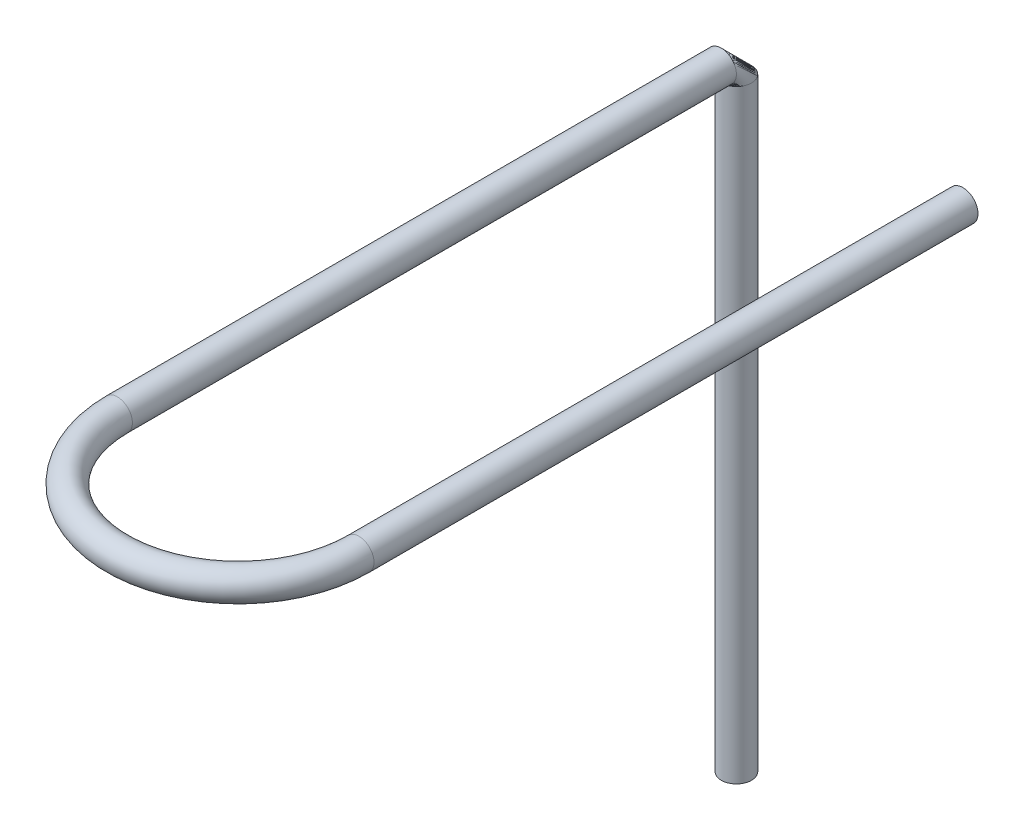
ISO-10303-21;
HEADER;
FILE_DESCRIPTION(('STEP AP214'),'2;1');
FILE_NAME('part.step','',(''),(''),'','','');
FILE_SCHEMA(('AUTOMOTIVE_DESIGN { 1 0 10303 214 1 1 1 1 }'));
ENDSEC;
DATA;
#1=APPLICATION_CONTEXT('core data for automotive mechanical design processes');
#2=APPLICATION_PROTOCOL_DEFINITION('international standard','automotive_design',2000,#1);
#3=PRODUCT_CONTEXT('',#1,'mechanical');
#4=PRODUCT('Part','Part','',(#3));
#5=PRODUCT_RELATED_PRODUCT_CATEGORY('part','',(#4));
#6=PRODUCT_DEFINITION_FORMATION('','',#4);
#7=PRODUCT_DEFINITION_CONTEXT('part definition',#1,'design');
#8=PRODUCT_DEFINITION('design','',#6,#7);
#9=PRODUCT_DEFINITION_SHAPE('','',#8);
#10=(LENGTH_UNIT() NAMED_UNIT(*) SI_UNIT(.MILLI.,.METRE.));
#11=(NAMED_UNIT(*) PLANE_ANGLE_UNIT() SI_UNIT($,.RADIAN.));
#12=(NAMED_UNIT(*) SI_UNIT($,.STERADIAN.) SOLID_ANGLE_UNIT());
#13=UNCERTAINTY_MEASURE_WITH_UNIT(LENGTH_MEASURE(1.E-05),#10,'distance_accuracy_value','');
#14=(GEOMETRIC_REPRESENTATION_CONTEXT(3) GLOBAL_UNCERTAINTY_ASSIGNED_CONTEXT((#13)) GLOBAL_UNIT_ASSIGNED_CONTEXT((#10,
#11,#12)) REPRESENTATION_CONTEXT('',''));
#15=CARTESIAN_POINT('',(0.,0.,0.));
#16=DIRECTION('',(0.,0.,1.));
#17=DIRECTION('',(1.,0.,0.));
#18=AXIS2_PLACEMENT_3D('',#15,#16,#17);
#19=CARTESIAN_POINT('',(4.,0.,0.));
#20=DIRECTION('',(0.,0.,1.));
#21=DIRECTION('',(1.,0.,0.));
#22=AXIS2_PLACEMENT_3D('',#19,#20,#21);
#23=PLANE('',#22);
#24=CARTESIAN_POINT('',(4.,0.,0.));
#25=DIRECTION('',(0.,0.,1.));
#26=DIRECTION('',(1.,0.,0.));
#27=AXIS2_PLACEMENT_3D('',#24,#25,#26);
#28=CIRCLE('',#27,0.25);
#29=CARTESIAN_POINT('',(4.25,0.,0.));
#30=VERTEX_POINT('',#29);
#31=EDGE_CURVE('E12',#30,#30,#28,.T.);
#32=ORIENTED_EDGE('',*,*,#31,.F.);
#33=EDGE_LOOP('',(#32));
#34=FACE_BOUND('',#33,.T.);
#35=ADVANCED_FACE('F57',(#34),#23,.F.);
#36=CARTESIAN_POINT('',(0.,0.,0.));
#37=DIRECTION('',(0.,0.,1.));
#38=DIRECTION('',(1.,0.,0.));
#39=AXIS2_PLACEMENT_3D('',#36,#37,#38);
#40=CYLINDRICAL_SURFACE('',#39,0.25);
#41=CARTESIAN_POINT('',(0.,0.,10.));
#42=DIRECTION('',(0.,0.,-1.));
#43=DIRECTION('',(-1.,0.,0.));
#44=AXIS2_PLACEMENT_3D('',#41,#42,#43);
#45=CIRCLE('',#44,0.25);
#46=CARTESIAN_POINT('',(-0.25,0.,10.));
#47=VERTEX_POINT('',#46);
#48=EDGE_CURVE('E84',#47,#47,#45,.T.);
#49=ORIENTED_EDGE('',*,*,#48,.T.);
#50=EDGE_LOOP('',(#49));
#51=FACE_BOUND('',#50,.T.);
#52=CARTESIAN_POINT('',(0.,0.,0.));
#53=DIRECTION('',(0.,0.,-1.));
#54=DIRECTION('',(-1.,0.,0.));
#55=AXIS2_PLACEMENT_3D('',#52,#53,#54);
#56=CIRCLE('',#55,0.25);
#57=CARTESIAN_POINT('',(0.,-0.25,0.));
#58=VERTEX_POINT('',#57);
#59=EDGE_CURVE('E70',#58,#58,#56,.T.);
#60=ORIENTED_EDGE('',*,*,#59,.F.);
#61=EDGE_LOOP('',(#60));
#62=FACE_BOUND('',#61,.T.);
#63=ADVANCED_FACE('F104',(#51,#62),#40,.T.);
#64=CARTESIAN_POINT('',(2.,0.,10.));
#65=DIRECTION('',(0.,1.,0.));
#66=DIRECTION('',(0.,0.,1.));
#67=AXIS2_PLACEMENT_3D('',#64,#65,#66);
#68=TOROIDAL_SURFACE('',#67,2.,0.25);
#69=CARTESIAN_POINT('',(4.,0.,10.));
#70=DIRECTION('',(0.,0.,1.));
#71=DIRECTION('',(1.,0.,0.));
#72=AXIS2_PLACEMENT_3D('',#69,#70,#71);
#73=CIRCLE('',#72,0.25);
#74=CARTESIAN_POINT('',(4.25,0.,10.));
#75=VERTEX_POINT('',#74);
#76=EDGE_CURVE('E64',#75,#75,#73,.T.);
#77=CARTESIAN_POINT('',(2.,0.,10.));
#78=DIRECTION('',(0.,1.,0.));
#79=DIRECTION('',(0.,0.,1.));
#80=AXIS2_PLACEMENT_3D('',#77,#78,#79);
#81=CIRCLE('',#80,2.25);
#82=EDGE_CURVE('',#47,#75,#81,.T.);
#83=ORIENTED_EDGE('',*,*,#48,.F.);
#84=ORIENTED_EDGE('',*,*,#76,.T.);
#85=ORIENTED_EDGE('',*,*,#82,.T.);
#86=ORIENTED_EDGE('',*,*,#82,.F.);
#87=EDGE_LOOP('',(#83,#85,#84,#86));
#88=FACE_BOUND('',#87,.T.);
#89=ADVANCED_FACE('F92',(#88),#68,.T.);
#90=CARTESIAN_POINT('',(4.,0.,10.));
#91=DIRECTION('',(0.,0.,-1.));
#92=DIRECTION('',(-1.,0.,0.));
#93=AXIS2_PLACEMENT_3D('',#90,#91,#92);
#94=CYLINDRICAL_SURFACE('',#93,0.25);
#95=ORIENTED_EDGE('',*,*,#31,.T.);
#96=EDGE_LOOP('',(#95));
#97=FACE_BOUND('',#96,.T.);
#98=ORIENTED_EDGE('',*,*,#76,.F.);
#99=EDGE_LOOP('',(#98));
#100=FACE_BOUND('',#99,.T.);
#101=ADVANCED_FACE('F95',(#97,#100),#94,.T.);
#102=CARTESIAN_POINT('',(0.,-10.25,-0.250000000000001));
#103=DIRECTION('',(0.,1.,0.));
#104=DIRECTION('',(0.,0.,1.));
#105=AXIS2_PLACEMENT_3D('',#102,#103,#104);
#106=PLANE('',#105);
#107=CARTESIAN_POINT('',(0.,-10.25,-0.250000000000001));
#108=DIRECTION('',(0.,1.,0.));
#109=DIRECTION('',(0.,0.,1.));
#110=AXIS2_PLACEMENT_3D('',#107,#108,#109);
#111=CIRCLE('',#110,0.25);
#112=CARTESIAN_POINT('',(0.,-10.25,0.));
#113=VERTEX_POINT('',#112);
#114=EDGE_CURVE('E78',#113,#113,#111,.T.);
#115=ORIENTED_EDGE('',*,*,#114,.F.);
#116=EDGE_LOOP('',(#115));
#117=FACE_BOUND('',#116,.T.);
#118=ADVANCED_FACE('F97',(#117),#106,.F.);
#119=CARTESIAN_POINT('',(0.,-0.25,0.));
#120=DIRECTION('',(-1.,0.,0.));
#121=DIRECTION('',(0.,0.,1.));
#122=AXIS2_PLACEMENT_3D('',#119,#120,#121);
#123=DEGENERATE_TOROIDAL_SURFACE('',#122,0.25,0.25,.T.);
#124=CARTESIAN_POINT('',(0.,-0.25,-0.249999999999999));
#125=DIRECTION('',(0.,1.,0.));
#126=DIRECTION('',(0.,0.,1.));
#127=AXIS2_PLACEMENT_3D('',#124,#125,#126);
#128=CIRCLE('',#127,0.25);
#129=EDGE_CURVE('E82',#58,#58,#128,.T.);
#130=ORIENTED_EDGE('',*,*,#129,.T.);
#131=ORIENTED_EDGE('',*,*,#59,.T.);
#132=EDGE_LOOP('',(#130,#131));
#133=FACE_BOUND('',#132,.T.);
#134=ADVANCED_FACE('F102',(#133),#123,.T.);
#135=CARTESIAN_POINT('',(0.,-0.25,-0.25));
#136=DIRECTION('',(0.,-1.,0.));
#137=DIRECTION('',(0.,0.,-1.));
#138=AXIS2_PLACEMENT_3D('',#135,#136,#137);
#139=CYLINDRICAL_SURFACE('',#138,0.25);
#140=ORIENTED_EDGE('',*,*,#114,.T.);
#141=EDGE_LOOP('',(#140));
#142=FACE_BOUND('',#141,.T.);
#143=ORIENTED_EDGE('',*,*,#129,.F.);
#144=EDGE_LOOP('',(#143));
#145=FACE_BOUND('',#144,.T.);
#146=ADVANCED_FACE('F79',(#142,#145),#139,.T.);
#147=CLOSED_SHELL('',(#35,#63,#89,#101,#118,#134,#146));
#148=MANIFOLD_SOLID_BREP('B2',#147);
#149=ADVANCED_BREP_SHAPE_REPRESENTATION('',(#18,#148),#14);
#150=SHAPE_DEFINITION_REPRESENTATION(#9,#149);
ENDSEC;
END-ISO-10303-21;
